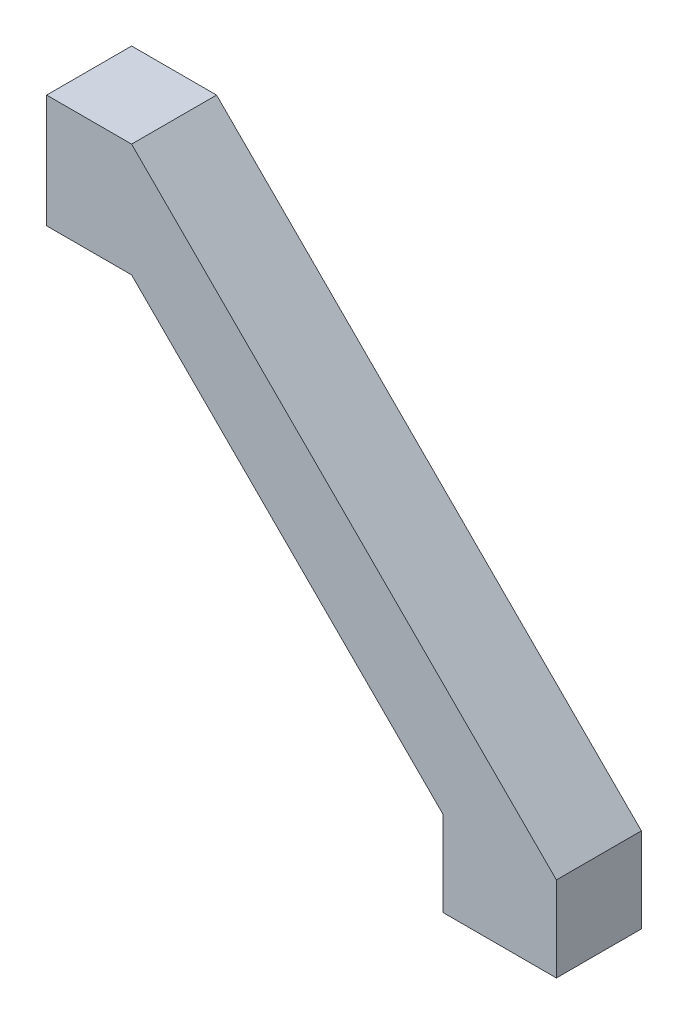
ISO-10303-21;
HEADER;
FILE_DESCRIPTION(('STEP AP214'),'2;1');
FILE_NAME('part.step','',(''),(''),'','','');
FILE_SCHEMA(('AUTOMOTIVE_DESIGN { 1 0 10303 214 1 1 1 1 }'));
ENDSEC;
DATA;
#1=APPLICATION_CONTEXT('core data for automotive mechanical design processes');
#2=APPLICATION_PROTOCOL_DEFINITION('international standard','automotive_design',2000,#1);
#3=PRODUCT_CONTEXT('',#1,'mechanical');
#4=PRODUCT('Part','Part','',(#3));
#5=PRODUCT_RELATED_PRODUCT_CATEGORY('part','',(#4));
#6=PRODUCT_DEFINITION_FORMATION('','',#4);
#7=PRODUCT_DEFINITION_CONTEXT('part definition',#1,'design');
#8=PRODUCT_DEFINITION('design','',#6,#7);
#9=PRODUCT_DEFINITION_SHAPE('','',#8);
#10=(LENGTH_UNIT() NAMED_UNIT(*) SI_UNIT(.MILLI.,.METRE.));
#11=(NAMED_UNIT(*) PLANE_ANGLE_UNIT() SI_UNIT($,.RADIAN.));
#12=(NAMED_UNIT(*) SI_UNIT($,.STERADIAN.) SOLID_ANGLE_UNIT());
#13=UNCERTAINTY_MEASURE_WITH_UNIT(LENGTH_MEASURE(1.E-05),#10,'distance_accuracy_value','');
#14=(GEOMETRIC_REPRESENTATION_CONTEXT(3) GLOBAL_UNCERTAINTY_ASSIGNED_CONTEXT((#13)) GLOBAL_UNIT_ASSIGNED_CONTEXT((#10,
#11,#12)) REPRESENTATION_CONTEXT('',''));
#15=CARTESIAN_POINT('',(0.,0.,0.));
#16=DIRECTION('',(0.,0.,1.));
#17=DIRECTION('',(1.,0.,0.));
#18=AXIS2_PLACEMENT_3D('',#15,#16,#17);
#19=CARTESIAN_POINT('',(-8.,0.,6.));
#20=DIRECTION('',(0.,1.,0.));
#21=DIRECTION('',(0.,0.,1.));
#22=AXIS2_PLACEMENT_3D('',#19,#20,#21);
#23=PLANE('',#22);
#24=DIRECTION('',(1.,0.,0.));
#25=VECTOR('',#24,1.);
#26=CARTESIAN_POINT('',(-8.,0.,0.));
#27=LINE('',#26,#25);
#28=CARTESIAN_POINT('',(-8.,0.,0.));
#29=VERTEX_POINT('',#28);
#30=CARTESIAN_POINT('',(0.,0.,0.));
#31=VERTEX_POINT('',#30);
#32=EDGE_CURVE('E144',#29,#31,#27,.T.);
#33=ORIENTED_EDGE('',*,*,#32,.T.);
#34=DIRECTION('',(0.,0.,-1.));
#35=VECTOR('',#34,1.);
#36=CARTESIAN_POINT('',(0.,0.,6.));
#37=LINE('',#36,#35);
#38=CARTESIAN_POINT('',(0.,0.,6.));
#39=VERTEX_POINT('',#38);
#40=EDGE_CURVE('E11',#39,#31,#37,.T.);
#41=ORIENTED_EDGE('',*,*,#40,.F.);
#42=DIRECTION('',(1.,0.,0.));
#43=VECTOR('',#42,1.);
#44=CARTESIAN_POINT('',(-8.,0.,6.));
#45=LINE('',#44,#43);
#46=CARTESIAN_POINT('',(-8.,0.,6.));
#47=VERTEX_POINT('',#46);
#48=EDGE_CURVE('E166',#47,#39,#45,.T.);
#49=ORIENTED_EDGE('',*,*,#48,.F.);
#50=DIRECTION('',(0.,0.,-1.));
#51=VECTOR('',#50,1.);
#52=CARTESIAN_POINT('',(-8.,0.,6.));
#53=LINE('',#52,#51);
#54=EDGE_CURVE('E140',#47,#29,#53,.T.);
#55=ORIENTED_EDGE('',*,*,#54,.T.);
#56=EDGE_LOOP('',(#33,#41,#49,#55));
#57=FACE_BOUND('',#56,.T.);
#58=ADVANCED_FACE('F43',(#57),#23,.F.);
#59=CARTESIAN_POINT('',(0.,0.,6.));
#60=DIRECTION('',(-1.,0.,0.));
#61=DIRECTION('',(0.,0.,1.));
#62=AXIS2_PLACEMENT_3D('',#59,#60,#61);
#63=PLANE('',#62);
#64=DIRECTION('',(0.,1.,0.));
#65=VECTOR('',#64,1.);
#66=CARTESIAN_POINT('',(0.,0.,0.));
#67=LINE('',#66,#65);
#68=CARTESIAN_POINT('',(0.,6.,0.));
#69=VERTEX_POINT('',#68);
#70=EDGE_CURVE('E148',#31,#69,#67,.T.);
#71=ORIENTED_EDGE('',*,*,#70,.T.);
#72=DIRECTION('',(0.,0.,-1.));
#73=VECTOR('',#72,1.);
#74=CARTESIAN_POINT('',(0.,6.,6.));
#75=LINE('',#74,#73);
#76=CARTESIAN_POINT('',(0.,6.,6.));
#77=VERTEX_POINT('',#76);
#78=EDGE_CURVE('E52',#77,#69,#75,.T.);
#79=ORIENTED_EDGE('',*,*,#78,.F.);
#80=DIRECTION('',(0.,1.,0.));
#81=VECTOR('',#80,1.);
#82=CARTESIAN_POINT('',(0.,0.,6.));
#83=LINE('',#82,#81);
#84=EDGE_CURVE('E103',#39,#77,#83,.T.);
#85=ORIENTED_EDGE('',*,*,#84,.F.);
#86=ORIENTED_EDGE('',*,*,#40,.T.);
#87=EDGE_LOOP('',(#71,#79,#85,#86));
#88=FACE_BOUND('',#87,.T.);
#89=ADVANCED_FACE('F212',(#88),#63,.F.);
#90=CARTESIAN_POINT('',(0.,6.,6.));
#91=DIRECTION('',(-0.707106781186548,-0.707106781186548,0.));
#92=DIRECTION('',(0.707106781186548,-0.707106781186548,0.));
#93=AXIS2_PLACEMENT_3D('',#90,#91,#92);
#94=PLANE('',#93);
#95=DIRECTION('',(-0.707106781186547,0.707106781186547,0.));
#96=VECTOR('',#95,1.);
#97=CARTESIAN_POINT('',(0.,6.,0.));
#98=LINE('',#97,#96);
#99=CARTESIAN_POINT('',(-30.,36.,0.));
#100=VERTEX_POINT('',#99);
#101=EDGE_CURVE('E151',#69,#100,#98,.T.);
#102=ORIENTED_EDGE('',*,*,#101,.T.);
#103=DIRECTION('',(0.,0.,-1.));
#104=VECTOR('',#103,1.);
#105=CARTESIAN_POINT('',(-30.,36.,6.));
#106=LINE('',#105,#104);
#107=CARTESIAN_POINT('',(-30.,36.,6.));
#108=VERTEX_POINT('',#107);
#109=EDGE_CURVE('E177',#108,#100,#106,.T.);
#110=ORIENTED_EDGE('',*,*,#109,.F.);
#111=DIRECTION('',(-0.707106781186547,0.707106781186547,0.));
#112=VECTOR('',#111,1.);
#113=CARTESIAN_POINT('',(0.,6.,6.));
#114=LINE('',#113,#112);
#115=EDGE_CURVE('E187',#77,#108,#114,.T.);
#116=ORIENTED_EDGE('',*,*,#115,.F.);
#117=ORIENTED_EDGE('',*,*,#78,.T.);
#118=EDGE_LOOP('',(#102,#110,#116,#117));
#119=FACE_BOUND('',#118,.T.);
#120=ADVANCED_FACE('F185',(#119),#94,.F.);
#121=CARTESIAN_POINT('',(-30.,36.,6.));
#122=DIRECTION('',(0.,-1.,0.));
#123=DIRECTION('',(0.,0.,-1.));
#124=AXIS2_PLACEMENT_3D('',#121,#122,#123);
#125=PLANE('',#124);
#126=DIRECTION('',(-1.,0.,0.));
#127=VECTOR('',#126,1.);
#128=CARTESIAN_POINT('',(-30.,36.,0.));
#129=LINE('',#128,#127);
#130=CARTESIAN_POINT('',(-36.,36.,0.));
#131=VERTEX_POINT('',#130);
#132=EDGE_CURVE('E154',#100,#131,#129,.T.);
#133=ORIENTED_EDGE('',*,*,#132,.T.);
#134=DIRECTION('',(0.,0.,-1.));
#135=VECTOR('',#134,1.);
#136=CARTESIAN_POINT('',(-36.,36.,6.));
#137=LINE('',#136,#135);
#138=CARTESIAN_POINT('',(-36.,36.,6.));
#139=VERTEX_POINT('',#138);
#140=EDGE_CURVE('E173',#139,#131,#137,.T.);
#141=ORIENTED_EDGE('',*,*,#140,.F.);
#142=DIRECTION('',(-1.,0.,0.));
#143=VECTOR('',#142,1.);
#144=CARTESIAN_POINT('',(-30.,36.,6.));
#145=LINE('',#144,#143);
#146=EDGE_CURVE('E200',#108,#139,#145,.T.);
#147=ORIENTED_EDGE('',*,*,#146,.F.);
#148=ORIENTED_EDGE('',*,*,#109,.T.);
#149=EDGE_LOOP('',(#133,#141,#147,#148));
#150=FACE_BOUND('',#149,.T.);
#151=ADVANCED_FACE('F195',(#150),#125,.F.);
#152=CARTESIAN_POINT('',(-36.,36.,6.));
#153=DIRECTION('',(1.,0.,0.));
#154=DIRECTION('',(0.,0.,-1.));
#155=AXIS2_PLACEMENT_3D('',#152,#153,#154);
#156=PLANE('',#155);
#157=DIRECTION('',(0.,-1.,0.));
#158=VECTOR('',#157,1.);
#159=CARTESIAN_POINT('',(-36.,36.,0.));
#160=LINE('',#159,#158);
#161=CARTESIAN_POINT('',(-36.,28.,0.));
#162=VERTEX_POINT('',#161);
#163=EDGE_CURVE('E157',#131,#162,#160,.T.);
#164=ORIENTED_EDGE('',*,*,#163,.T.);
#165=DIRECTION('',(0.,0.,-1.));
#166=VECTOR('',#165,1.);
#167=CARTESIAN_POINT('',(-36.,28.,6.));
#168=LINE('',#167,#166);
#169=CARTESIAN_POINT('',(-36.,28.,6.));
#170=VERTEX_POINT('',#169);
#171=EDGE_CURVE('E133',#170,#162,#168,.T.);
#172=ORIENTED_EDGE('',*,*,#171,.F.);
#173=DIRECTION('',(0.,-1.,0.));
#174=VECTOR('',#173,1.);
#175=CARTESIAN_POINT('',(-36.,36.,6.));
#176=LINE('',#175,#174);
#177=EDGE_CURVE('E122',#139,#170,#176,.T.);
#178=ORIENTED_EDGE('',*,*,#177,.F.);
#179=ORIENTED_EDGE('',*,*,#140,.T.);
#180=EDGE_LOOP('',(#164,#172,#178,#179));
#181=FACE_BOUND('',#180,.T.);
#182=ADVANCED_FACE('F198',(#181),#156,.F.);
#183=CARTESIAN_POINT('',(-36.,28.,6.));
#184=DIRECTION('',(0.,1.,0.));
#185=DIRECTION('',(0.,0.,1.));
#186=AXIS2_PLACEMENT_3D('',#183,#184,#185);
#187=PLANE('',#186);
#188=DIRECTION('',(1.,0.,0.));
#189=VECTOR('',#188,1.);
#190=CARTESIAN_POINT('',(-36.,28.,0.));
#191=LINE('',#190,#189);
#192=CARTESIAN_POINT('',(-30.,28.,0.));
#193=VERTEX_POINT('',#192);
#194=EDGE_CURVE('E131',#162,#193,#191,.T.);
#195=ORIENTED_EDGE('',*,*,#194,.T.);
#196=DIRECTION('',(0.,0.,-1.));
#197=VECTOR('',#196,1.);
#198=CARTESIAN_POINT('',(-30.,28.,6.));
#199=LINE('',#198,#197);
#200=CARTESIAN_POINT('',(-30.,28.,6.));
#201=VERTEX_POINT('',#200);
#202=EDGE_CURVE('E128',#201,#193,#199,.T.);
#203=ORIENTED_EDGE('',*,*,#202,.F.);
#204=DIRECTION('',(1.,0.,0.));
#205=VECTOR('',#204,1.);
#206=CARTESIAN_POINT('',(-36.,28.,6.));
#207=LINE('',#206,#205);
#208=EDGE_CURVE('E116',#170,#201,#207,.T.);
#209=ORIENTED_EDGE('',*,*,#208,.F.);
#210=ORIENTED_EDGE('',*,*,#171,.T.);
#211=EDGE_LOOP('',(#195,#203,#209,#210));
#212=FACE_BOUND('',#211,.T.);
#213=ADVANCED_FACE('F129',(#212),#187,.F.);
#214=CARTESIAN_POINT('',(-30.,28.,6.));
#215=DIRECTION('',(0.707106781186547,0.707106781186547,0.));
#216=DIRECTION('',(-0.707106781186548,0.707106781186548,0.));
#217=AXIS2_PLACEMENT_3D('',#214,#215,#216);
#218=PLANE('',#217);
#219=DIRECTION('',(0.707106781186548,-0.707106781186548,0.));
#220=VECTOR('',#219,1.);
#221=CARTESIAN_POINT('',(-30.,28.,0.));
#222=LINE('',#221,#220);
#223=CARTESIAN_POINT('',(-8.,6.,0.));
#224=VERTEX_POINT('',#223);
#225=EDGE_CURVE('E89',#193,#224,#222,.T.);
#226=ORIENTED_EDGE('',*,*,#225,.T.);
#227=DIRECTION('',(0.,0.,-1.));
#228=VECTOR('',#227,1.);
#229=CARTESIAN_POINT('',(-8.,6.,6.));
#230=LINE('',#229,#228);
#231=CARTESIAN_POINT('',(-8.,6.,6.));
#232=VERTEX_POINT('',#231);
#233=EDGE_CURVE('E134',#232,#224,#230,.T.);
#234=ORIENTED_EDGE('',*,*,#233,.F.);
#235=DIRECTION('',(0.707106781186548,-0.707106781186548,0.));
#236=VECTOR('',#235,1.);
#237=CARTESIAN_POINT('',(-30.,28.,6.));
#238=LINE('',#237,#236);
#239=EDGE_CURVE('E120',#201,#232,#238,.T.);
#240=ORIENTED_EDGE('',*,*,#239,.F.);
#241=ORIENTED_EDGE('',*,*,#202,.T.);
#242=EDGE_LOOP('',(#226,#234,#240,#241));
#243=FACE_BOUND('',#242,.T.);
#244=ADVANCED_FACE('F136',(#243),#218,.F.);
#245=CARTESIAN_POINT('',(-8.,6.,6.));
#246=DIRECTION('',(1.,0.,0.));
#247=DIRECTION('',(0.,0.,-1.));
#248=AXIS2_PLACEMENT_3D('',#245,#246,#247);
#249=PLANE('',#248);
#250=DIRECTION('',(0.,-1.,0.));
#251=VECTOR('',#250,1.);
#252=CARTESIAN_POINT('',(-8.,6.,0.));
#253=LINE('',#252,#251);
#254=EDGE_CURVE('E95',#224,#29,#253,.T.);
#255=ORIENTED_EDGE('',*,*,#254,.T.);
#256=ORIENTED_EDGE('',*,*,#54,.F.);
#257=DIRECTION('',(0.,-1.,0.));
#258=VECTOR('',#257,1.);
#259=CARTESIAN_POINT('',(-8.,6.,6.));
#260=LINE('',#259,#258);
#261=EDGE_CURVE('E60',#232,#47,#260,.T.);
#262=ORIENTED_EDGE('',*,*,#261,.F.);
#263=ORIENTED_EDGE('',*,*,#233,.T.);
#264=EDGE_LOOP('',(#255,#256,#262,#263));
#265=FACE_BOUND('',#264,.T.);
#266=ADVANCED_FACE('F228',(#265),#249,.F.);
#267=CARTESIAN_POINT('',(0.,0.,6.));
#268=DIRECTION('',(0.,0.,1.));
#269=DIRECTION('',(1.,0.,0.));
#270=AXIS2_PLACEMENT_3D('',#267,#268,#269);
#271=PLANE('',#270);
#272=ORIENTED_EDGE('',*,*,#48,.T.);
#273=ORIENTED_EDGE('',*,*,#84,.T.);
#274=ORIENTED_EDGE('',*,*,#115,.T.);
#275=ORIENTED_EDGE('',*,*,#146,.T.);
#276=ORIENTED_EDGE('',*,*,#177,.T.);
#277=ORIENTED_EDGE('',*,*,#208,.T.);
#278=ORIENTED_EDGE('',*,*,#239,.T.);
#279=ORIENTED_EDGE('',*,*,#261,.T.);
#280=EDGE_LOOP('',(#272,#273,#274,#275,#276,#277,#278,#279));
#281=FACE_BOUND('',#280,.T.);
#282=ADVANCED_FACE('F118',(#281),#271,.T.);
#283=CARTESIAN_POINT('',(0.,0.,0.));
#284=DIRECTION('',(0.,0.,1.));
#285=DIRECTION('',(1.,0.,0.));
#286=AXIS2_PLACEMENT_3D('',#283,#284,#285);
#287=PLANE('',#286);
#288=ORIENTED_EDGE('',*,*,#32,.F.);
#289=ORIENTED_EDGE('',*,*,#254,.F.);
#290=ORIENTED_EDGE('',*,*,#225,.F.);
#291=ORIENTED_EDGE('',*,*,#194,.F.);
#292=ORIENTED_EDGE('',*,*,#163,.F.);
#293=ORIENTED_EDGE('',*,*,#132,.F.);
#294=ORIENTED_EDGE('',*,*,#101,.F.);
#295=ORIENTED_EDGE('',*,*,#70,.F.);
#296=EDGE_LOOP('',(#288,#289,#290,#291,#292,#293,#294,#295));
#297=FACE_BOUND('',#296,.T.);
#298=ADVANCED_FACE('F191',(#297),#287,.F.);
#299=CLOSED_SHELL('',(#58,#89,#120,#151,#182,#213,#244,#266,#282,#298));
#300=MANIFOLD_SOLID_BREP('B2',#299);
#301=ADVANCED_BREP_SHAPE_REPRESENTATION('',(#18,#300),#14);
#302=SHAPE_DEFINITION_REPRESENTATION(#9,#301);
ENDSEC;
END-ISO-10303-21;
